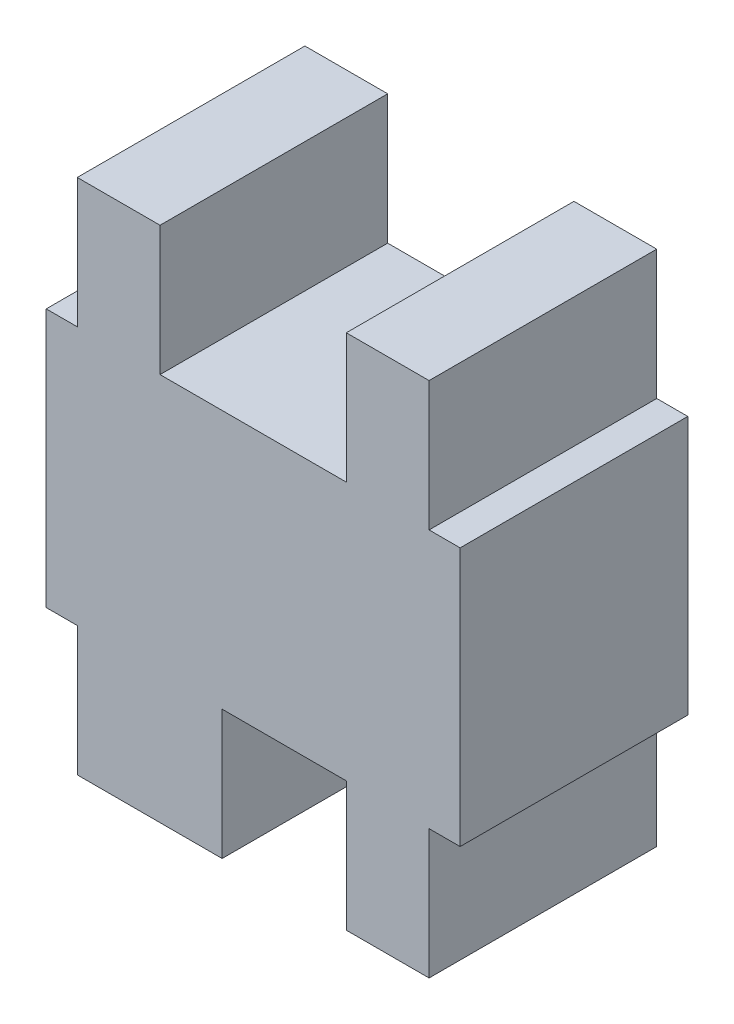
ISO-10303-21;
HEADER;
FILE_DESCRIPTION(('STEP AP214'),'2;1');
FILE_NAME('part.step','',(''),(''),'','','');
FILE_SCHEMA(('AUTOMOTIVE_DESIGN { 1 0 10303 214 1 1 1 1 }'));
ENDSEC;
DATA;
#1=APPLICATION_CONTEXT('core data for automotive mechanical design processes');
#2=APPLICATION_PROTOCOL_DEFINITION('international standard','automotive_design',2000,#1);
#3=PRODUCT_CONTEXT('',#1,'mechanical');
#4=PRODUCT('Part','Part','',(#3));
#5=PRODUCT_RELATED_PRODUCT_CATEGORY('part','',(#4));
#6=PRODUCT_DEFINITION_FORMATION('','',#4);
#7=PRODUCT_DEFINITION_CONTEXT('part definition',#1,'design');
#8=PRODUCT_DEFINITION('design','',#6,#7);
#9=PRODUCT_DEFINITION_SHAPE('','',#8);
#10=(LENGTH_UNIT() NAMED_UNIT(*) SI_UNIT(.MILLI.,.METRE.));
#11=(NAMED_UNIT(*) PLANE_ANGLE_UNIT() SI_UNIT($,.RADIAN.));
#12=(NAMED_UNIT(*) SI_UNIT($,.STERADIAN.) SOLID_ANGLE_UNIT());
#13=UNCERTAINTY_MEASURE_WITH_UNIT(LENGTH_MEASURE(1.E-05),#10,'distance_accuracy_value','');
#14=(GEOMETRIC_REPRESENTATION_CONTEXT(3) GLOBAL_UNCERTAINTY_ASSIGNED_CONTEXT((#13)) GLOBAL_UNIT_ASSIGNED_CONTEXT((#10,
#11,#12)) REPRESENTATION_CONTEXT('',''));
#15=CARTESIAN_POINT('',(0.,0.,0.));
#16=DIRECTION('',(0.,0.,1.));
#17=DIRECTION('',(1.,0.,0.));
#18=AXIS2_PLACEMENT_3D('',#15,#16,#17);
#19=CARTESIAN_POINT('',(-1.,-0.625,1.1));
#20=DIRECTION('',(1.,0.,0.));
#21=DIRECTION('',(0.,0.,-1.));
#22=AXIS2_PLACEMENT_3D('',#19,#20,#21);
#23=PLANE('',#22);
#24=DIRECTION('',(0.,-1.,0.));
#25=VECTOR('',#24,1.);
#26=CARTESIAN_POINT('',(-1.,-0.625,0.));
#27=LINE('',#26,#25);
#28=CARTESIAN_POINT('',(-1.,0.625,0.));
#29=VERTEX_POINT('',#28);
#30=CARTESIAN_POINT('',(-1.,-0.625,0.));
#31=VERTEX_POINT('',#30);
#32=EDGE_CURVE('E202',#29,#31,#27,.T.);
#33=ORIENTED_EDGE('',*,*,#32,.T.);
#34=DIRECTION('',(0.,0.,-1.));
#35=VECTOR('',#34,1.);
#36=CARTESIAN_POINT('',(-1.,-0.625,1.1));
#37=LINE('',#36,#35);
#38=CARTESIAN_POINT('',(-1.,-0.625,1.1));
#39=VERTEX_POINT('',#38);
#40=EDGE_CURVE('E11',#39,#31,#37,.T.);
#41=ORIENTED_EDGE('',*,*,#40,.F.);
#42=DIRECTION('',(0.,-1.,0.));
#43=VECTOR('',#42,1.);
#44=CARTESIAN_POINT('',(-1.,-0.625,1.1));
#45=LINE('',#44,#43);
#46=CARTESIAN_POINT('',(-1.,0.625,1.1));
#47=VERTEX_POINT('',#46);
#48=EDGE_CURVE('E240',#47,#39,#45,.T.);
#49=ORIENTED_EDGE('',*,*,#48,.F.);
#50=DIRECTION('',(0.,0.,-1.));
#51=VECTOR('',#50,1.);
#52=CARTESIAN_POINT('',(-1.,0.625,1.1));
#53=LINE('',#52,#51);
#54=EDGE_CURVE('E198',#47,#29,#53,.T.);
#55=ORIENTED_EDGE('',*,*,#54,.T.);
#56=EDGE_LOOP('',(#33,#41,#49,#55));
#57=FACE_BOUND('',#56,.T.);
#58=ADVANCED_FACE('F34',(#57),#23,.F.);
#59=CARTESIAN_POINT('',(-0.85,-0.625,1.1));
#60=DIRECTION('',(0.,1.,0.));
#61=DIRECTION('',(0.,0.,1.));
#62=AXIS2_PLACEMENT_3D('',#59,#60,#61);
#63=PLANE('',#62);
#64=DIRECTION('',(1.,0.,0.));
#65=VECTOR('',#64,1.);
#66=CARTESIAN_POINT('',(-0.85,-0.625,0.));
#67=LINE('',#66,#65);
#68=CARTESIAN_POINT('',(-0.85,-0.625,0.));
#69=VERTEX_POINT('',#68);
#70=EDGE_CURVE('E205',#31,#69,#67,.T.);
#71=ORIENTED_EDGE('',*,*,#70,.T.);
#72=DIRECTION('',(0.,0.,-1.));
#73=VECTOR('',#72,1.);
#74=CARTESIAN_POINT('',(-0.85,-0.625,1.1));
#75=LINE('',#74,#73);
#76=CARTESIAN_POINT('',(-0.85,-0.625,1.1));
#77=VERTEX_POINT('',#76);
#78=EDGE_CURVE('E42',#77,#69,#75,.T.);
#79=ORIENTED_EDGE('',*,*,#78,.F.);
#80=DIRECTION('',(1.,0.,0.));
#81=VECTOR('',#80,1.);
#82=CARTESIAN_POINT('',(-0.85,-0.625,1.1));
#83=LINE('',#82,#81);
#84=EDGE_CURVE('E129',#39,#77,#83,.T.);
#85=ORIENTED_EDGE('',*,*,#84,.F.);
#86=ORIENTED_EDGE('',*,*,#40,.T.);
#87=EDGE_LOOP('',(#71,#79,#85,#86));
#88=FACE_BOUND('',#87,.T.);
#89=ADVANCED_FACE('F358',(#88),#63,.F.);
#90=CARTESIAN_POINT('',(-0.85,-1.25,1.1));
#91=DIRECTION('',(1.,0.,0.));
#92=DIRECTION('',(0.,0.,-1.));
#93=AXIS2_PLACEMENT_3D('',#90,#91,#92);
#94=PLANE('',#93);
#95=DIRECTION('',(0.,-1.,0.));
#96=VECTOR('',#95,1.);
#97=CARTESIAN_POINT('',(-0.85,-1.25,0.));
#98=LINE('',#97,#96);
#99=CARTESIAN_POINT('',(-0.85,-1.25,0.));
#100=VERTEX_POINT('',#99);
#101=EDGE_CURVE('E207',#69,#100,#98,.T.);
#102=ORIENTED_EDGE('',*,*,#101,.T.);
#103=DIRECTION('',(0.,0.,-1.));
#104=VECTOR('',#103,1.);
#105=CARTESIAN_POINT('',(-0.85,-1.25,1.1));
#106=LINE('',#105,#104);
#107=CARTESIAN_POINT('',(-0.85,-1.25,1.1));
#108=VERTEX_POINT('',#107);
#109=EDGE_CURVE('E283',#108,#100,#106,.T.);
#110=ORIENTED_EDGE('',*,*,#109,.F.);
#111=DIRECTION('',(0.,-1.,0.));
#112=VECTOR('',#111,1.);
#113=CARTESIAN_POINT('',(-0.85,-1.25,1.1));
#114=LINE('',#113,#112);
#115=EDGE_CURVE('E291',#77,#108,#114,.T.);
#116=ORIENTED_EDGE('',*,*,#115,.F.);
#117=ORIENTED_EDGE('',*,*,#78,.T.);
#118=EDGE_LOOP('',(#102,#110,#116,#117));
#119=FACE_BOUND('',#118,.T.);
#120=ADVANCED_FACE('F289',(#119),#94,.F.);
#121=CARTESIAN_POINT('',(-0.15,-1.25,1.1));
#122=DIRECTION('',(0.,1.,0.));
#123=DIRECTION('',(0.,0.,1.));
#124=AXIS2_PLACEMENT_3D('',#121,#122,#123);
#125=PLANE('',#124);
#126=DIRECTION('',(1.,0.,0.));
#127=VECTOR('',#126,1.);
#128=CARTESIAN_POINT('',(-0.15,-1.25,0.));
#129=LINE('',#128,#127);
#130=CARTESIAN_POINT('',(-0.15,-1.25,0.));
#131=VERTEX_POINT('',#130);
#132=EDGE_CURVE('E209',#100,#131,#129,.T.);
#133=ORIENTED_EDGE('',*,*,#132,.T.);
#134=DIRECTION('',(0.,0.,-1.));
#135=VECTOR('',#134,1.);
#136=CARTESIAN_POINT('',(-0.15,-1.25,1.1));
#137=LINE('',#136,#135);
#138=CARTESIAN_POINT('',(-0.15,-1.25,1.1));
#139=VERTEX_POINT('',#138);
#140=EDGE_CURVE('E280',#139,#131,#137,.T.);
#141=ORIENTED_EDGE('',*,*,#140,.F.);
#142=DIRECTION('',(1.,0.,0.));
#143=VECTOR('',#142,1.);
#144=CARTESIAN_POINT('',(-0.15,-1.25,1.1));
#145=LINE('',#144,#143);
#146=EDGE_CURVE('E309',#108,#139,#145,.T.);
#147=ORIENTED_EDGE('',*,*,#146,.F.);
#148=ORIENTED_EDGE('',*,*,#109,.T.);
#149=EDGE_LOOP('',(#133,#141,#147,#148));
#150=FACE_BOUND('',#149,.T.);
#151=ADVANCED_FACE('F300',(#150),#125,.F.);
#152=CARTESIAN_POINT('',(-0.15,-0.625,1.1));
#153=DIRECTION('',(-1.,0.,0.));
#154=DIRECTION('',(0.,0.,1.));
#155=AXIS2_PLACEMENT_3D('',#152,#153,#154);
#156=PLANE('',#155);
#157=DIRECTION('',(0.,1.,0.));
#158=VECTOR('',#157,1.);
#159=CARTESIAN_POINT('',(-0.15,-0.625,0.));
#160=LINE('',#159,#158);
#161=CARTESIAN_POINT('',(-0.15,-0.625,0.));
#162=VERTEX_POINT('',#161);
#163=EDGE_CURVE('E211',#131,#162,#160,.T.);
#164=ORIENTED_EDGE('',*,*,#163,.T.);
#165=DIRECTION('',(0.,0.,-1.));
#166=VECTOR('',#165,1.);
#167=CARTESIAN_POINT('',(-0.15,-0.625,1.1));
#168=LINE('',#167,#166);
#169=CARTESIAN_POINT('',(-0.15,-0.625,1.1));
#170=VERTEX_POINT('',#169);
#171=EDGE_CURVE('E277',#170,#162,#168,.T.);
#172=ORIENTED_EDGE('',*,*,#171,.F.);
#173=DIRECTION('',(0.,1.,0.));
#174=VECTOR('',#173,1.);
#175=CARTESIAN_POINT('',(-0.15,-0.625,1.1));
#176=LINE('',#175,#174);
#177=EDGE_CURVE('E306',#139,#170,#176,.T.);
#178=ORIENTED_EDGE('',*,*,#177,.F.);
#179=ORIENTED_EDGE('',*,*,#140,.T.);
#180=EDGE_LOOP('',(#164,#172,#178,#179));
#181=FACE_BOUND('',#180,.T.);
#182=ADVANCED_FACE('F304',(#181),#156,.F.);
#183=CARTESIAN_POINT('',(0.45,-0.625,1.1));
#184=DIRECTION('',(0.,1.,0.));
#185=DIRECTION('',(0.,0.,1.));
#186=AXIS2_PLACEMENT_3D('',#183,#184,#185);
#187=PLANE('',#186);
#188=DIRECTION('',(1.,0.,0.));
#189=VECTOR('',#188,1.);
#190=CARTESIAN_POINT('',(0.45,-0.625,0.));
#191=LINE('',#190,#189);
#192=CARTESIAN_POINT('',(0.45,-0.625,0.));
#193=VERTEX_POINT('',#192);
#194=EDGE_CURVE('E213',#162,#193,#191,.T.);
#195=ORIENTED_EDGE('',*,*,#194,.T.);
#196=DIRECTION('',(0.,0.,-1.));
#197=VECTOR('',#196,1.);
#198=CARTESIAN_POINT('',(0.45,-0.625,1.1));
#199=LINE('',#198,#197);
#200=CARTESIAN_POINT('',(0.45,-0.625,1.1));
#201=VERTEX_POINT('',#200);
#202=EDGE_CURVE('E274',#201,#193,#199,.T.);
#203=ORIENTED_EDGE('',*,*,#202,.F.);
#204=DIRECTION('',(1.,0.,0.));
#205=VECTOR('',#204,1.);
#206=CARTESIAN_POINT('',(0.45,-0.625,1.1));
#207=LINE('',#206,#205);
#208=EDGE_CURVE('E308',#170,#201,#207,.T.);
#209=ORIENTED_EDGE('',*,*,#208,.F.);
#210=ORIENTED_EDGE('',*,*,#171,.T.);
#211=EDGE_LOOP('',(#195,#203,#209,#210));
#212=FACE_BOUND('',#211,.T.);
#213=ADVANCED_FACE('F371',(#212),#187,.F.);
#214=CARTESIAN_POINT('',(0.45,-1.25,1.1));
#215=DIRECTION('',(1.,0.,0.));
#216=DIRECTION('',(0.,0.,-1.));
#217=AXIS2_PLACEMENT_3D('',#214,#215,#216);
#218=PLANE('',#217);
#219=DIRECTION('',(0.,-1.,0.));
#220=VECTOR('',#219,1.);
#221=CARTESIAN_POINT('',(0.45,-1.25,0.));
#222=LINE('',#221,#220);
#223=CARTESIAN_POINT('',(0.45,-1.25,0.));
#224=VERTEX_POINT('',#223);
#225=EDGE_CURVE('E215',#193,#224,#222,.T.);
#226=ORIENTED_EDGE('',*,*,#225,.T.);
#227=DIRECTION('',(0.,0.,-1.));
#228=VECTOR('',#227,1.);
#229=CARTESIAN_POINT('',(0.45,-1.25,1.1));
#230=LINE('',#229,#228);
#231=CARTESIAN_POINT('',(0.45,-1.25,1.1));
#232=VERTEX_POINT('',#231);
#233=EDGE_CURVE('E271',#232,#224,#230,.T.);
#234=ORIENTED_EDGE('',*,*,#233,.F.);
#235=DIRECTION('',(0.,-1.,0.));
#236=VECTOR('',#235,1.);
#237=CARTESIAN_POINT('',(0.45,-1.25,1.1));
#238=LINE('',#237,#236);
#239=EDGE_CURVE('E311',#201,#232,#238,.T.);
#240=ORIENTED_EDGE('',*,*,#239,.F.);
#241=ORIENTED_EDGE('',*,*,#202,.T.);
#242=EDGE_LOOP('',(#226,#234,#240,#241));
#243=FACE_BOUND('',#242,.T.);
#244=ADVANCED_FACE('F374',(#243),#218,.F.);
#245=CARTESIAN_POINT('',(0.85,-1.25,1.1));
#246=DIRECTION('',(0.,1.,0.));
#247=DIRECTION('',(0.,0.,1.));
#248=AXIS2_PLACEMENT_3D('',#245,#246,#247);
#249=PLANE('',#248);
#250=DIRECTION('',(1.,0.,0.));
#251=VECTOR('',#250,1.);
#252=CARTESIAN_POINT('',(0.85,-1.25,0.));
#253=LINE('',#252,#251);
#254=CARTESIAN_POINT('',(0.85,-1.25,0.));
#255=VERTEX_POINT('',#254);
#256=EDGE_CURVE('E217',#224,#255,#253,.T.);
#257=ORIENTED_EDGE('',*,*,#256,.T.);
#258=DIRECTION('',(0.,0.,-1.));
#259=VECTOR('',#258,1.);
#260=CARTESIAN_POINT('',(0.85,-1.25,1.1));
#261=LINE('',#260,#259);
#262=CARTESIAN_POINT('',(0.85,-1.25,1.1));
#263=VERTEX_POINT('',#262);
#264=EDGE_CURVE('E268',#263,#255,#261,.T.);
#265=ORIENTED_EDGE('',*,*,#264,.F.);
#266=DIRECTION('',(1.,0.,0.));
#267=VECTOR('',#266,1.);
#268=CARTESIAN_POINT('',(0.85,-1.25,1.1));
#269=LINE('',#268,#267);
#270=EDGE_CURVE('E317',#232,#263,#269,.T.);
#271=ORIENTED_EDGE('',*,*,#270,.F.);
#272=ORIENTED_EDGE('',*,*,#233,.T.);
#273=EDGE_LOOP('',(#257,#265,#271,#272));
#274=FACE_BOUND('',#273,.T.);
#275=ADVANCED_FACE('F378',(#274),#249,.F.);
#276=CARTESIAN_POINT('',(0.85,-0.625,1.1));
#277=DIRECTION('',(-1.,0.,0.));
#278=DIRECTION('',(0.,0.,1.));
#279=AXIS2_PLACEMENT_3D('',#276,#277,#278);
#280=PLANE('',#279);
#281=DIRECTION('',(0.,1.,0.));
#282=VECTOR('',#281,1.);
#283=CARTESIAN_POINT('',(0.85,-0.625,0.));
#284=LINE('',#283,#282);
#285=CARTESIAN_POINT('',(0.85,-0.625,0.));
#286=VERTEX_POINT('',#285);
#287=EDGE_CURVE('E219',#255,#286,#284,.T.);
#288=ORIENTED_EDGE('',*,*,#287,.T.);
#289=DIRECTION('',(0.,0.,-1.));
#290=VECTOR('',#289,1.);
#291=CARTESIAN_POINT('',(0.85,-0.625,1.1));
#292=LINE('',#291,#290);
#293=CARTESIAN_POINT('',(0.85,-0.625,1.1));
#294=VERTEX_POINT('',#293);
#295=EDGE_CURVE('E265',#294,#286,#292,.T.);
#296=ORIENTED_EDGE('',*,*,#295,.F.);
#297=DIRECTION('',(0.,1.,0.));
#298=VECTOR('',#297,1.);
#299=CARTESIAN_POINT('',(0.85,-0.625,1.1));
#300=LINE('',#299,#298);
#301=EDGE_CURVE('E319',#263,#294,#300,.T.);
#302=ORIENTED_EDGE('',*,*,#301,.F.);
#303=ORIENTED_EDGE('',*,*,#264,.T.);
#304=EDGE_LOOP('',(#288,#296,#302,#303));
#305=FACE_BOUND('',#304,.T.);
#306=ADVANCED_FACE('F382',(#305),#280,.F.);
#307=CARTESIAN_POINT('',(1.,-0.625,1.1));
#308=DIRECTION('',(0.,1.,0.));
#309=DIRECTION('',(0.,0.,1.));
#310=AXIS2_PLACEMENT_3D('',#307,#308,#309);
#311=PLANE('',#310);
#312=DIRECTION('',(1.,0.,0.));
#313=VECTOR('',#312,1.);
#314=CARTESIAN_POINT('',(1.,-0.625,0.));
#315=LINE('',#314,#313);
#316=CARTESIAN_POINT('',(1.,-0.625,0.));
#317=VERTEX_POINT('',#316);
#318=EDGE_CURVE('E221',#286,#317,#315,.T.);
#319=ORIENTED_EDGE('',*,*,#318,.T.);
#320=DIRECTION('',(0.,0.,-1.));
#321=VECTOR('',#320,1.);
#322=CARTESIAN_POINT('',(1.,-0.625,1.1));
#323=LINE('',#322,#321);
#324=CARTESIAN_POINT('',(1.,-0.625,1.1));
#325=VERTEX_POINT('',#324);
#326=EDGE_CURVE('E262',#325,#317,#323,.T.);
#327=ORIENTED_EDGE('',*,*,#326,.F.);
#328=DIRECTION('',(1.,0.,0.));
#329=VECTOR('',#328,1.);
#330=CARTESIAN_POINT('',(1.,-0.625,1.1));
#331=LINE('',#330,#329);
#332=EDGE_CURVE('E321',#294,#325,#331,.T.);
#333=ORIENTED_EDGE('',*,*,#332,.F.);
#334=ORIENTED_EDGE('',*,*,#295,.T.);
#335=EDGE_LOOP('',(#319,#327,#333,#334));
#336=FACE_BOUND('',#335,.T.);
#337=ADVANCED_FACE('F386',(#336),#311,.F.);
#338=CARTESIAN_POINT('',(1.,0.625,1.1));
#339=DIRECTION('',(-1.,0.,0.));
#340=DIRECTION('',(0.,0.,1.));
#341=AXIS2_PLACEMENT_3D('',#338,#339,#340);
#342=PLANE('',#341);
#343=DIRECTION('',(0.,1.,0.));
#344=VECTOR('',#343,1.);
#345=CARTESIAN_POINT('',(1.,0.625,0.));
#346=LINE('',#345,#344);
#347=CARTESIAN_POINT('',(1.,0.625,0.));
#348=VERTEX_POINT('',#347);
#349=EDGE_CURVE('E223',#317,#348,#346,.T.);
#350=ORIENTED_EDGE('',*,*,#349,.T.);
#351=DIRECTION('',(0.,0.,-1.));
#352=VECTOR('',#351,1.);
#353=CARTESIAN_POINT('',(1.,0.625,1.1));
#354=LINE('',#353,#352);
#355=CARTESIAN_POINT('',(1.,0.625,1.1));
#356=VERTEX_POINT('',#355);
#357=EDGE_CURVE('E259',#356,#348,#354,.T.);
#358=ORIENTED_EDGE('',*,*,#357,.F.);
#359=DIRECTION('',(0.,1.,0.));
#360=VECTOR('',#359,1.);
#361=CARTESIAN_POINT('',(1.,0.625,1.1));
#362=LINE('',#361,#360);
#363=EDGE_CURVE('E323',#325,#356,#362,.T.);
#364=ORIENTED_EDGE('',*,*,#363,.F.);
#365=ORIENTED_EDGE('',*,*,#326,.T.);
#366=EDGE_LOOP('',(#350,#358,#364,#365));
#367=FACE_BOUND('',#366,.T.);
#368=ADVANCED_FACE('F390',(#367),#342,.F.);
#369=CARTESIAN_POINT('',(0.85,0.625,1.1));
#370=DIRECTION('',(0.,-1.,0.));
#371=DIRECTION('',(0.,0.,-1.));
#372=AXIS2_PLACEMENT_3D('',#369,#370,#371);
#373=PLANE('',#372);
#374=DIRECTION('',(-1.,0.,0.));
#375=VECTOR('',#374,1.);
#376=CARTESIAN_POINT('',(0.85,0.625,0.));
#377=LINE('',#376,#375);
#378=CARTESIAN_POINT('',(0.85,0.625,0.));
#379=VERTEX_POINT('',#378);
#380=EDGE_CURVE('E225',#348,#379,#377,.T.);
#381=ORIENTED_EDGE('',*,*,#380,.T.);
#382=DIRECTION('',(0.,0.,-1.));
#383=VECTOR('',#382,1.);
#384=CARTESIAN_POINT('',(0.85,0.625,1.1));
#385=LINE('',#384,#383);
#386=CARTESIAN_POINT('',(0.85,0.625,1.1));
#387=VERTEX_POINT('',#386);
#388=EDGE_CURVE('E256',#387,#379,#385,.T.);
#389=ORIENTED_EDGE('',*,*,#388,.F.);
#390=DIRECTION('',(-1.,0.,0.));
#391=VECTOR('',#390,1.);
#392=CARTESIAN_POINT('',(0.85,0.625,1.1));
#393=LINE('',#392,#391);
#394=EDGE_CURVE('E325',#356,#387,#393,.T.);
#395=ORIENTED_EDGE('',*,*,#394,.F.);
#396=ORIENTED_EDGE('',*,*,#357,.T.);
#397=EDGE_LOOP('',(#381,#389,#395,#396));
#398=FACE_BOUND('',#397,.T.);
#399=ADVANCED_FACE('F394',(#398),#373,.F.);
#400=CARTESIAN_POINT('',(0.85,1.25,1.1));
#401=DIRECTION('',(-1.,0.,0.));
#402=DIRECTION('',(0.,0.,1.));
#403=AXIS2_PLACEMENT_3D('',#400,#401,#402);
#404=PLANE('',#403);
#405=DIRECTION('',(0.,1.,0.));
#406=VECTOR('',#405,1.);
#407=CARTESIAN_POINT('',(0.85,1.25,0.));
#408=LINE('',#407,#406);
#409=CARTESIAN_POINT('',(0.85,1.25,0.));
#410=VERTEX_POINT('',#409);
#411=EDGE_CURVE('E227',#379,#410,#408,.T.);
#412=ORIENTED_EDGE('',*,*,#411,.T.);
#413=DIRECTION('',(0.,0.,-1.));
#414=VECTOR('',#413,1.);
#415=CARTESIAN_POINT('',(0.85,1.25,1.1));
#416=LINE('',#415,#414);
#417=CARTESIAN_POINT('',(0.85,1.25,1.1));
#418=VERTEX_POINT('',#417);
#419=EDGE_CURVE('E253',#418,#410,#416,.T.);
#420=ORIENTED_EDGE('',*,*,#419,.F.);
#421=DIRECTION('',(0.,1.,0.));
#422=VECTOR('',#421,1.);
#423=CARTESIAN_POINT('',(0.85,1.25,1.1));
#424=LINE('',#423,#422);
#425=EDGE_CURVE('E327',#387,#418,#424,.T.);
#426=ORIENTED_EDGE('',*,*,#425,.F.);
#427=ORIENTED_EDGE('',*,*,#388,.T.);
#428=EDGE_LOOP('',(#412,#420,#426,#427));
#429=FACE_BOUND('',#428,.T.);
#430=ADVANCED_FACE('F398',(#429),#404,.F.);
#431=CARTESIAN_POINT('',(0.45,1.25,1.1));
#432=DIRECTION('',(0.,-1.,0.));
#433=DIRECTION('',(0.,0.,-1.));
#434=AXIS2_PLACEMENT_3D('',#431,#432,#433);
#435=PLANE('',#434);
#436=DIRECTION('',(-1.,0.,0.));
#437=VECTOR('',#436,1.);
#438=CARTESIAN_POINT('',(0.45,1.25,0.));
#439=LINE('',#438,#437);
#440=CARTESIAN_POINT('',(0.45,1.25,0.));
#441=VERTEX_POINT('',#440);
#442=EDGE_CURVE('E229',#410,#441,#439,.T.);
#443=ORIENTED_EDGE('',*,*,#442,.T.);
#444=DIRECTION('',(0.,0.,-1.));
#445=VECTOR('',#444,1.);
#446=CARTESIAN_POINT('',(0.45,1.25,1.1));
#447=LINE('',#446,#445);
#448=CARTESIAN_POINT('',(0.45,1.25,1.1));
#449=VERTEX_POINT('',#448);
#450=EDGE_CURVE('E250',#449,#441,#447,.T.);
#451=ORIENTED_EDGE('',*,*,#450,.F.);
#452=DIRECTION('',(-1.,0.,0.));
#453=VECTOR('',#452,1.);
#454=CARTESIAN_POINT('',(0.45,1.25,1.1));
#455=LINE('',#454,#453);
#456=EDGE_CURVE('E329',#418,#449,#455,.T.);
#457=ORIENTED_EDGE('',*,*,#456,.F.);
#458=ORIENTED_EDGE('',*,*,#419,.T.);
#459=EDGE_LOOP('',(#443,#451,#457,#458));
#460=FACE_BOUND('',#459,.T.);
#461=ADVANCED_FACE('F402',(#460),#435,.F.);
#462=CARTESIAN_POINT('',(0.45,0.625,1.1));
#463=DIRECTION('',(1.,0.,0.));
#464=DIRECTION('',(0.,0.,-1.));
#465=AXIS2_PLACEMENT_3D('',#462,#463,#464);
#466=PLANE('',#465);
#467=DIRECTION('',(0.,-1.,0.));
#468=VECTOR('',#467,1.);
#469=CARTESIAN_POINT('',(0.45,0.625,0.));
#470=LINE('',#469,#468);
#471=CARTESIAN_POINT('',(0.45,0.625,0.));
#472=VERTEX_POINT('',#471);
#473=EDGE_CURVE('E231',#441,#472,#470,.T.);
#474=ORIENTED_EDGE('',*,*,#473,.T.);
#475=DIRECTION('',(0.,0.,-1.));
#476=VECTOR('',#475,1.);
#477=CARTESIAN_POINT('',(0.45,0.625,1.1));
#478=LINE('',#477,#476);
#479=CARTESIAN_POINT('',(0.45,0.625,1.1));
#480=VERTEX_POINT('',#479);
#481=EDGE_CURVE('E247',#480,#472,#478,.T.);
#482=ORIENTED_EDGE('',*,*,#481,.F.);
#483=DIRECTION('',(0.,-1.,0.));
#484=VECTOR('',#483,1.);
#485=CARTESIAN_POINT('',(0.45,0.625,1.1));
#486=LINE('',#485,#484);
#487=EDGE_CURVE('E331',#449,#480,#486,.T.);
#488=ORIENTED_EDGE('',*,*,#487,.F.);
#489=ORIENTED_EDGE('',*,*,#450,.T.);
#490=EDGE_LOOP('',(#474,#482,#488,#489));
#491=FACE_BOUND('',#490,.T.);
#492=ADVANCED_FACE('F406',(#491),#466,.F.);
#493=CARTESIAN_POINT('',(-0.45,0.625,1.1));
#494=DIRECTION('',(0.,-1.,0.));
#495=DIRECTION('',(0.,0.,-1.));
#496=AXIS2_PLACEMENT_3D('',#493,#494,#495);
#497=PLANE('',#496);
#498=DIRECTION('',(-1.,0.,0.));
#499=VECTOR('',#498,1.);
#500=CARTESIAN_POINT('',(-0.45,0.625,0.));
#501=LINE('',#500,#499);
#502=CARTESIAN_POINT('',(-0.45,0.625,0.));
#503=VERTEX_POINT('',#502);
#504=EDGE_CURVE('E233',#472,#503,#501,.T.);
#505=ORIENTED_EDGE('',*,*,#504,.T.);
#506=DIRECTION('',(0.,0.,-1.));
#507=VECTOR('',#506,1.);
#508=CARTESIAN_POINT('',(-0.45,0.625,1.1));
#509=LINE('',#508,#507);
#510=CARTESIAN_POINT('',(-0.45,0.625,1.1));
#511=VERTEX_POINT('',#510);
#512=EDGE_CURVE('E244',#511,#503,#509,.T.);
#513=ORIENTED_EDGE('',*,*,#512,.F.);
#514=DIRECTION('',(-1.,0.,0.));
#515=VECTOR('',#514,1.);
#516=CARTESIAN_POINT('',(-0.45,0.625,1.1));
#517=LINE('',#516,#515);
#518=EDGE_CURVE('E333',#480,#511,#517,.T.);
#519=ORIENTED_EDGE('',*,*,#518,.F.);
#520=ORIENTED_EDGE('',*,*,#481,.T.);
#521=EDGE_LOOP('',(#505,#513,#519,#520));
#522=FACE_BOUND('',#521,.T.);
#523=ADVANCED_FACE('F339',(#522),#497,.F.);
#524=CARTESIAN_POINT('',(-0.45,1.25,1.1));
#525=DIRECTION('',(-1.,0.,0.));
#526=DIRECTION('',(0.,0.,1.));
#527=AXIS2_PLACEMENT_3D('',#524,#525,#526);
#528=PLANE('',#527);
#529=DIRECTION('',(0.,1.,0.));
#530=VECTOR('',#529,1.);
#531=CARTESIAN_POINT('',(-0.45,1.25,0.));
#532=LINE('',#531,#530);
#533=CARTESIAN_POINT('',(-0.45,1.25,0.));
#534=VERTEX_POINT('',#533);
#535=EDGE_CURVE('E235',#503,#534,#532,.T.);
#536=ORIENTED_EDGE('',*,*,#535,.T.);
#537=DIRECTION('',(0.,0.,-1.));
#538=VECTOR('',#537,1.);
#539=CARTESIAN_POINT('',(-0.45,1.25,1.1));
#540=LINE('',#539,#538);
#541=CARTESIAN_POINT('',(-0.45,1.25,1.1));
#542=VERTEX_POINT('',#541);
#543=EDGE_CURVE('E193',#542,#534,#540,.T.);
#544=ORIENTED_EDGE('',*,*,#543,.F.);
#545=DIRECTION('',(0.,1.,0.));
#546=VECTOR('',#545,1.);
#547=CARTESIAN_POINT('',(-0.45,1.25,1.1));
#548=LINE('',#547,#546);
#549=EDGE_CURVE('E184',#511,#542,#548,.T.);
#550=ORIENTED_EDGE('',*,*,#549,.F.);
#551=ORIENTED_EDGE('',*,*,#512,.T.);
#552=EDGE_LOOP('',(#536,#544,#550,#551));
#553=FACE_BOUND('',#552,.T.);
#554=ADVANCED_FACE('F343',(#553),#528,.F.);
#555=CARTESIAN_POINT('',(-0.85,1.25,1.1));
#556=DIRECTION('',(0.,-1.,0.));
#557=DIRECTION('',(0.,0.,-1.));
#558=AXIS2_PLACEMENT_3D('',#555,#556,#557);
#559=PLANE('',#558);
#560=DIRECTION('',(-1.,0.,0.));
#561=VECTOR('',#560,1.);
#562=CARTESIAN_POINT('',(-0.85,1.25,0.));
#563=LINE('',#562,#561);
#564=CARTESIAN_POINT('',(-0.85,1.25,0.));
#565=VERTEX_POINT('',#564);
#566=EDGE_CURVE('E192',#534,#565,#563,.T.);
#567=ORIENTED_EDGE('',*,*,#566,.T.);
#568=DIRECTION('',(0.,0.,-1.));
#569=VECTOR('',#568,1.);
#570=CARTESIAN_POINT('',(-0.85,1.25,1.1));
#571=LINE('',#570,#569);
#572=CARTESIAN_POINT('',(-0.85,1.25,1.1));
#573=VERTEX_POINT('',#572);
#574=EDGE_CURVE('E189',#573,#565,#571,.T.);
#575=ORIENTED_EDGE('',*,*,#574,.F.);
#576=DIRECTION('',(-1.,0.,0.));
#577=VECTOR('',#576,1.);
#578=CARTESIAN_POINT('',(-0.85,1.25,1.1));
#579=LINE('',#578,#577);
#580=EDGE_CURVE('E178',#542,#573,#579,.T.);
#581=ORIENTED_EDGE('',*,*,#580,.F.);
#582=ORIENTED_EDGE('',*,*,#543,.T.);
#583=EDGE_LOOP('',(#567,#575,#581,#582));
#584=FACE_BOUND('',#583,.T.);
#585=ADVANCED_FACE('F190',(#584),#559,.F.);
#586=CARTESIAN_POINT('',(-0.85,0.625,1.1));
#587=DIRECTION('',(1.,0.,0.));
#588=DIRECTION('',(0.,0.,-1.));
#589=AXIS2_PLACEMENT_3D('',#586,#587,#588);
#590=PLANE('',#589);
#591=DIRECTION('',(0.,-1.,0.));
#592=VECTOR('',#591,1.);
#593=CARTESIAN_POINT('',(-0.85,0.625,0.));
#594=LINE('',#593,#592);
#595=CARTESIAN_POINT('',(-0.85,0.625,0.));
#596=VERTEX_POINT('',#595);
#597=EDGE_CURVE('E115',#565,#596,#594,.T.);
#598=ORIENTED_EDGE('',*,*,#597,.T.);
#599=DIRECTION('',(0.,0.,-1.));
#600=VECTOR('',#599,1.);
#601=CARTESIAN_POINT('',(-0.85,0.625,1.1));
#602=LINE('',#601,#600);
#603=CARTESIAN_POINT('',(-0.85,0.625,1.1));
#604=VERTEX_POINT('',#603);
#605=EDGE_CURVE('E194',#604,#596,#602,.T.);
#606=ORIENTED_EDGE('',*,*,#605,.F.);
#607=DIRECTION('',(0.,-1.,0.));
#608=VECTOR('',#607,1.);
#609=CARTESIAN_POINT('',(-0.85,0.625,1.1));
#610=LINE('',#609,#608);
#611=EDGE_CURVE('E182',#573,#604,#610,.T.);
#612=ORIENTED_EDGE('',*,*,#611,.F.);
#613=ORIENTED_EDGE('',*,*,#574,.T.);
#614=EDGE_LOOP('',(#598,#606,#612,#613));
#615=FACE_BOUND('',#614,.T.);
#616=ADVANCED_FACE('F196',(#615),#590,.F.);
#617=CARTESIAN_POINT('',(-1.,0.625,1.1));
#618=DIRECTION('',(0.,-1.,0.));
#619=DIRECTION('',(0.,0.,-1.));
#620=AXIS2_PLACEMENT_3D('',#617,#618,#619);
#621=PLANE('',#620);
#622=DIRECTION('',(-1.,0.,0.));
#623=VECTOR('',#622,1.);
#624=CARTESIAN_POINT('',(-1.,0.625,0.));
#625=LINE('',#624,#623);
#626=EDGE_CURVE('E121',#596,#29,#625,.T.);
#627=ORIENTED_EDGE('',*,*,#626,.T.);
#628=ORIENTED_EDGE('',*,*,#54,.F.);
#629=DIRECTION('',(-1.,0.,0.));
#630=VECTOR('',#629,1.);
#631=CARTESIAN_POINT('',(-1.,0.625,1.1));
#632=LINE('',#631,#630);
#633=EDGE_CURVE('E50',#604,#47,#632,.T.);
#634=ORIENTED_EDGE('',*,*,#633,.F.);
#635=ORIENTED_EDGE('',*,*,#605,.T.);
#636=EDGE_LOOP('',(#627,#628,#634,#635));
#637=FACE_BOUND('',#636,.T.);
#638=ADVANCED_FACE('F347',(#637),#621,.F.);
#639=CARTESIAN_POINT('',(0.,0.,1.1));
#640=DIRECTION('',(0.,0.,-1.));
#641=DIRECTION('',(-1.,0.,0.));
#642=AXIS2_PLACEMENT_3D('',#639,#640,#641);
#643=PLANE('',#642);
#644=ORIENTED_EDGE('',*,*,#48,.T.);
#645=ORIENTED_EDGE('',*,*,#84,.T.);
#646=ORIENTED_EDGE('',*,*,#115,.T.);
#647=ORIENTED_EDGE('',*,*,#146,.T.);
#648=ORIENTED_EDGE('',*,*,#177,.T.);
#649=ORIENTED_EDGE('',*,*,#208,.T.);
#650=ORIENTED_EDGE('',*,*,#239,.T.);
#651=ORIENTED_EDGE('',*,*,#270,.T.);
#652=ORIENTED_EDGE('',*,*,#301,.T.);
#653=ORIENTED_EDGE('',*,*,#332,.T.);
#654=ORIENTED_EDGE('',*,*,#363,.T.);
#655=ORIENTED_EDGE('',*,*,#394,.T.);
#656=ORIENTED_EDGE('',*,*,#425,.T.);
#657=ORIENTED_EDGE('',*,*,#456,.T.);
#658=ORIENTED_EDGE('',*,*,#487,.T.);
#659=ORIENTED_EDGE('',*,*,#518,.T.);
#660=ORIENTED_EDGE('',*,*,#549,.T.);
#661=ORIENTED_EDGE('',*,*,#580,.T.);
#662=ORIENTED_EDGE('',*,*,#611,.T.);
#663=ORIENTED_EDGE('',*,*,#633,.T.);
#664=EDGE_LOOP('',(#644,#645,#646,#647,#648,#649,#650,#651,#652,#653,#654,#655,#656,#657,#658,
#659,#660,#661,#662,#663));
#665=FACE_BOUND('',#664,.T.);
#666=ADVANCED_FACE('F180',(#665),#643,.F.);
#667=CARTESIAN_POINT('',(0.,0.,0.));
#668=DIRECTION('',(0.,0.,-1.));
#669=DIRECTION('',(-1.,0.,0.));
#670=AXIS2_PLACEMENT_3D('',#667,#668,#669);
#671=PLANE('',#670);
#672=ORIENTED_EDGE('',*,*,#32,.F.);
#673=ORIENTED_EDGE('',*,*,#626,.F.);
#674=ORIENTED_EDGE('',*,*,#597,.F.);
#675=ORIENTED_EDGE('',*,*,#566,.F.);
#676=ORIENTED_EDGE('',*,*,#535,.F.);
#677=ORIENTED_EDGE('',*,*,#504,.F.);
#678=ORIENTED_EDGE('',*,*,#473,.F.);
#679=ORIENTED_EDGE('',*,*,#442,.F.);
#680=ORIENTED_EDGE('',*,*,#411,.F.);
#681=ORIENTED_EDGE('',*,*,#380,.F.);
#682=ORIENTED_EDGE('',*,*,#349,.F.);
#683=ORIENTED_EDGE('',*,*,#318,.F.);
#684=ORIENTED_EDGE('',*,*,#287,.F.);
#685=ORIENTED_EDGE('',*,*,#256,.F.);
#686=ORIENTED_EDGE('',*,*,#225,.F.);
#687=ORIENTED_EDGE('',*,*,#194,.F.);
#688=ORIENTED_EDGE('',*,*,#163,.F.);
#689=ORIENTED_EDGE('',*,*,#132,.F.);
#690=ORIENTED_EDGE('',*,*,#101,.F.);
#691=ORIENTED_EDGE('',*,*,#70,.F.);
#692=EDGE_LOOP('',(#672,#673,#674,#675,#676,#677,#678,#679,#680,#681,#682,#683,#684,#685,#686,
#687,#688,#689,#690,#691));
#693=FACE_BOUND('',#692,.T.);
#694=ADVANCED_FACE('F295',(#693),#671,.T.);
#695=CLOSED_SHELL('',(#58,#89,#120,#151,#182,#213,#244,#275,#306,#337,#368,#399,#430,#461,#492,
#523,#554,#585,#616,#638,#666,#694));
#696=MANIFOLD_SOLID_BREP('B2',#695);
#697=ADVANCED_BREP_SHAPE_REPRESENTATION('',(#18,#696),#14);
#698=SHAPE_DEFINITION_REPRESENTATION(#9,#697);
ENDSEC;
END-ISO-10303-21;
